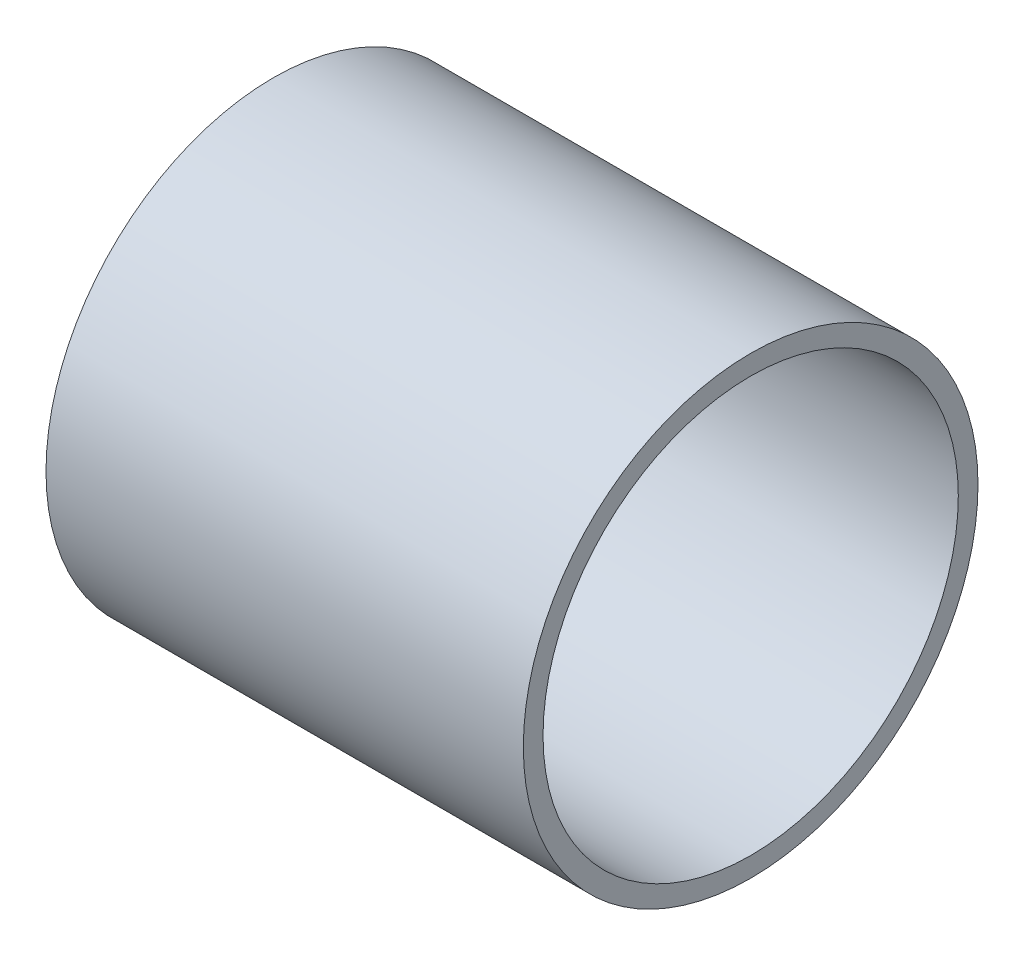
ISO-10303-21;
HEADER;
FILE_DESCRIPTION(('STEP AP214'),'2;1');
FILE_NAME('part.step','',(''),(''),'','','');
FILE_SCHEMA(('AUTOMOTIVE_DESIGN { 1 0 10303 214 1 1 1 1 }'));
ENDSEC;
DATA;
#1=APPLICATION_CONTEXT('core data for automotive mechanical design processes');
#2=APPLICATION_PROTOCOL_DEFINITION('international standard','automotive_design',2000,#1);
#3=PRODUCT_CONTEXT('',#1,'mechanical');
#4=PRODUCT('Part','Part','',(#3));
#5=PRODUCT_RELATED_PRODUCT_CATEGORY('part','',(#4));
#6=PRODUCT_DEFINITION_FORMATION('','',#4);
#7=PRODUCT_DEFINITION_CONTEXT('part definition',#1,'design');
#8=PRODUCT_DEFINITION('design','',#6,#7);
#9=PRODUCT_DEFINITION_SHAPE('','',#8);
#10=(LENGTH_UNIT() NAMED_UNIT(*) SI_UNIT(.MILLI.,.METRE.));
#11=(NAMED_UNIT(*) PLANE_ANGLE_UNIT() SI_UNIT($,.RADIAN.));
#12=(NAMED_UNIT(*) SI_UNIT($,.STERADIAN.) SOLID_ANGLE_UNIT());
#13=UNCERTAINTY_MEASURE_WITH_UNIT(LENGTH_MEASURE(1.E-05),#10,'distance_accuracy_value','');
#14=(GEOMETRIC_REPRESENTATION_CONTEXT(3) GLOBAL_UNCERTAINTY_ASSIGNED_CONTEXT((#13)) GLOBAL_UNIT_ASSIGNED_CONTEXT((#10,
#11,#12)) REPRESENTATION_CONTEXT('',''));
#15=CARTESIAN_POINT('',(0.,0.,0.));
#16=DIRECTION('',(0.,0.,1.));
#17=DIRECTION('',(1.,0.,0.));
#18=AXIS2_PLACEMENT_3D('',#15,#16,#17);
#19=CARTESIAN_POINT('',(20.,0.,0.));
#20=DIRECTION('',(-1.,0.,0.));
#21=DIRECTION('',(0.,0.,1.));
#22=AXIS2_PLACEMENT_3D('',#19,#20,#21);
#23=CYLINDRICAL_SURFACE('',#22,19.05);
#24=CARTESIAN_POINT('',(20.,0.,0.));
#25=DIRECTION('',(1.,0.,0.));
#26=DIRECTION('',(0.,0.,-1.));
#27=AXIS2_PLACEMENT_3D('',#24,#25,#26);
#28=CIRCLE('',#27,19.05);
#29=CARTESIAN_POINT('',(20.,0.,-19.05));
#30=VERTEX_POINT('',#29);
#31=EDGE_CURVE('E10',#30,#30,#28,.T.);
#32=ORIENTED_EDGE('',*,*,#31,.F.);
#33=EDGE_LOOP('',(#32));
#34=FACE_BOUND('',#33,.T.);
#35=CARTESIAN_POINT('',(-20.,0.,0.));
#36=DIRECTION('',(1.,0.,0.));
#37=DIRECTION('',(0.,0.,-1.));
#38=AXIS2_PLACEMENT_3D('',#35,#36,#37);
#39=CIRCLE('',#38,19.05);
#40=CARTESIAN_POINT('',(-20.,0.,-19.05));
#41=VERTEX_POINT('',#40);
#42=EDGE_CURVE('E40',#41,#41,#39,.T.);
#43=ORIENTED_EDGE('',*,*,#42,.T.);
#44=EDGE_LOOP('',(#43));
#45=FACE_BOUND('',#44,.T.);
#46=ADVANCED_FACE('F37',(#34,#45),#23,.T.);
#47=CARTESIAN_POINT('',(20.,0.,0.));
#48=DIRECTION('',(1.,0.,0.));
#49=DIRECTION('',(0.,0.,-1.));
#50=AXIS2_PLACEMENT_3D('',#47,#48,#49);
#51=PLANE('',#50);
#52=CARTESIAN_POINT('',(20.,0.,0.));
#53=DIRECTION('',(1.,0.,0.));
#54=DIRECTION('',(0.,0.,-1.));
#55=AXIS2_PLACEMENT_3D('',#52,#53,#54);
#56=CIRCLE('',#55,17.4);
#57=CARTESIAN_POINT('',(20.,0.,-17.4));
#58=VERTEX_POINT('',#57);
#59=EDGE_CURVE('E49',#58,#58,#56,.T.);
#60=ORIENTED_EDGE('',*,*,#59,.F.);
#61=EDGE_LOOP('',(#60));
#62=FACE_BOUND('',#61,.T.);
#63=ORIENTED_EDGE('',*,*,#31,.T.);
#64=EDGE_LOOP('',(#63));
#65=FACE_BOUND('',#64,.T.);
#66=ADVANCED_FACE('F64',(#62,#65),#51,.T.);
#67=CARTESIAN_POINT('',(-20.,0.,0.));
#68=DIRECTION('',(1.,0.,0.));
#69=DIRECTION('',(0.,0.,-1.));
#70=AXIS2_PLACEMENT_3D('',#67,#68,#69);
#71=PLANE('',#70);
#72=CARTESIAN_POINT('',(-20.,0.,0.));
#73=DIRECTION('',(-1.,0.,0.));
#74=DIRECTION('',(0.,0.,1.));
#75=AXIS2_PLACEMENT_3D('',#72,#73,#74);
#76=CIRCLE('',#75,17.4);
#77=CARTESIAN_POINT('',(-20.,0.,17.4));
#78=VERTEX_POINT('',#77);
#79=EDGE_CURVE('E54',#78,#78,#76,.T.);
#80=ORIENTED_EDGE('',*,*,#79,.F.);
#81=EDGE_LOOP('',(#80));
#82=FACE_BOUND('',#81,.T.);
#83=ORIENTED_EDGE('',*,*,#42,.F.);
#84=EDGE_LOOP('',(#83));
#85=FACE_BOUND('',#84,.T.);
#86=ADVANCED_FACE('F61',(#82,#85),#71,.F.);
#87=CARTESIAN_POINT('',(177.,0.,0.));
#88=DIRECTION('',(-1.,0.,0.));
#89=DIRECTION('',(0.,0.,1.));
#90=AXIS2_PLACEMENT_3D('',#87,#88,#89);
#91=CYLINDRICAL_SURFACE('',#90,17.4);
#92=ORIENTED_EDGE('',*,*,#59,.T.);
#93=EDGE_LOOP('',(#92));
#94=FACE_BOUND('',#93,.T.);
#95=ORIENTED_EDGE('',*,*,#79,.T.);
#96=EDGE_LOOP('',(#95));
#97=FACE_BOUND('',#96,.T.);
#98=ADVANCED_FACE('F59',(#94,#97),#91,.F.);
#99=CLOSED_SHELL('',(#46,#66,#86,#98));
#100=MANIFOLD_SOLID_BREP('B2',#99);
#101=ADVANCED_BREP_SHAPE_REPRESENTATION('',(#18,#100),#14);
#102=SHAPE_DEFINITION_REPRESENTATION(#9,#101);
ENDSEC;
END-ISO-10303-21;
